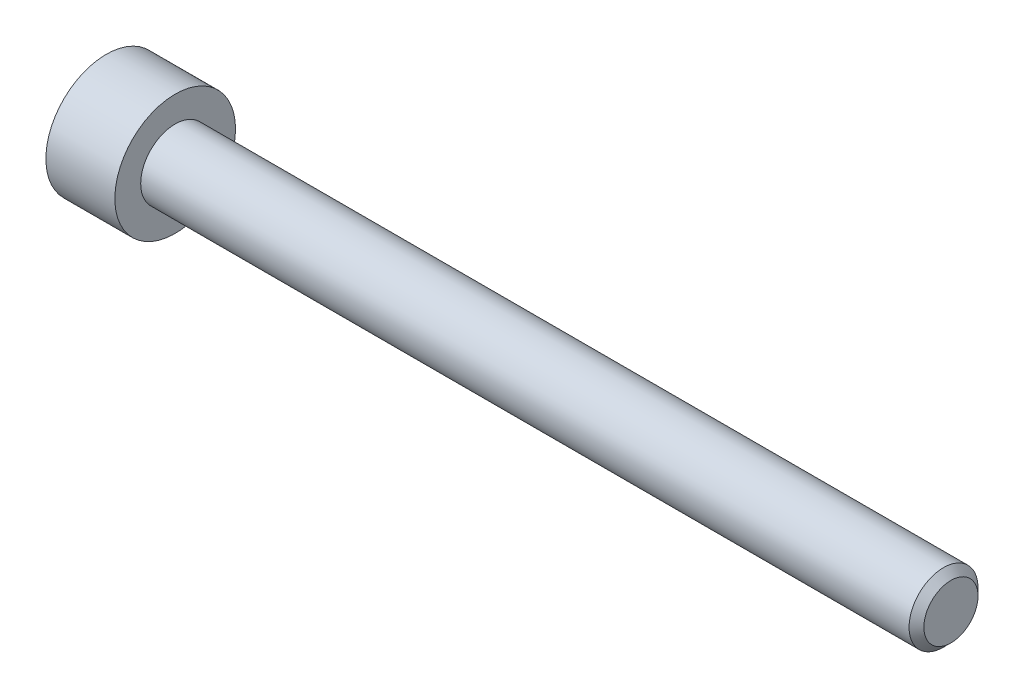
ISO-10303-21;
HEADER;
FILE_DESCRIPTION(('STEP AP214'),'2;1');
FILE_NAME('part.step','',(''),(''),'','','');
FILE_SCHEMA(('AUTOMOTIVE_DESIGN { 1 0 10303 214 1 1 1 1 }'));
ENDSEC;
DATA;
#1=APPLICATION_CONTEXT('core data for automotive mechanical design processes');
#2=APPLICATION_PROTOCOL_DEFINITION('international standard','automotive_design',2000,#1);
#3=PRODUCT_CONTEXT('',#1,'mechanical');
#4=PRODUCT('Part','Part','',(#3));
#5=PRODUCT_RELATED_PRODUCT_CATEGORY('part','',(#4));
#6=PRODUCT_DEFINITION_FORMATION('','',#4);
#7=PRODUCT_DEFINITION_CONTEXT('part definition',#1,'design');
#8=PRODUCT_DEFINITION('design','',#6,#7);
#9=PRODUCT_DEFINITION_SHAPE('','',#8);
#10=(LENGTH_UNIT() NAMED_UNIT(*) SI_UNIT(.MILLI.,.METRE.));
#11=(NAMED_UNIT(*) PLANE_ANGLE_UNIT() SI_UNIT($,.RADIAN.));
#12=(NAMED_UNIT(*) SI_UNIT($,.STERADIAN.) SOLID_ANGLE_UNIT());
#13=UNCERTAINTY_MEASURE_WITH_UNIT(LENGTH_MEASURE(1.E-05),#10,'distance_accuracy_value','');
#14=(GEOMETRIC_REPRESENTATION_CONTEXT(3) GLOBAL_UNCERTAINTY_ASSIGNED_CONTEXT((#13)) GLOBAL_UNIT_ASSIGNED_CONTEXT((#10,
#11,#12)) REPRESENTATION_CONTEXT('',''));
#15=CARTESIAN_POINT('',(0.,0.,0.));
#16=DIRECTION('',(0.,0.,1.));
#17=DIRECTION('',(1.,0.,0.));
#18=AXIS2_PLACEMENT_3D('',#15,#16,#17);
#19=CARTESIAN_POINT('',(-2.,0.,0.));
#20=DIRECTION('',(-1.,0.,0.));
#21=DIRECTION('',(0.,0.,1.));
#22=AXIS2_PLACEMENT_3D('',#19,#20,#21);
#23=PLANE('',#22);
#24=DIRECTION('',(0.,-1.,0.));
#25=VECTOR('',#24,1.);
#26=CARTESIAN_POINT('',(-2.,0.86602540378444,-1.5));
#27=LINE('',#26,#25);
#28=CARTESIAN_POINT('',(-2.,0.86602540378444,-1.5));
#29=VERTEX_POINT('',#28);
#30=CARTESIAN_POINT('',(-1.99999999998317,0.,-1.5));
#31=VERTEX_POINT('',#30);
#32=EDGE_CURVE('E157',#29,#31,#27,.T.);
#33=ORIENTED_EDGE('',*,*,#32,.T.);
#34=CARTESIAN_POINT('',(-1.99999999998317,0.,0.));
#35=DIRECTION('',(1.,0.,0.));
#36=DIRECTION('',(0.,0.,-1.));
#37=AXIS2_PLACEMENT_3D('',#34,#35,#36);
#38=CIRCLE('',#37,1.50000000002137);
#39=CARTESIAN_POINT('',(-1.99999999998317,1.29903810569517,-0.750000000010688));
#40=VERTEX_POINT('',#39);
#41=EDGE_CURVE('E48',#31,#40,#38,.T.);
#42=ORIENTED_EDGE('',*,*,#41,.T.);
#43=DIRECTION('',(0.,-0.500000000000001,-0.866025403784438));
#44=VECTOR('',#43,1.);
#45=CARTESIAN_POINT('',(-2.,1.73205080756888,0.));
#46=LINE('',#45,#44);
#47=EDGE_CURVE('E227',#40,#29,#46,.T.);
#48=ORIENTED_EDGE('',*,*,#47,.T.);
#49=EDGE_LOOP('',(#33,#42,#48));
#50=FACE_BOUND('',#49,.T.);
#51=ADVANCED_FACE('F33',(#50),#23,.T.);
#52=CARTESIAN_POINT('',(-2.,1.73205080756888,0.));
#53=VERTEX_POINT('',#52);
#54=EDGE_CURVE('E228',#53,#40,#46,.T.);
#55=ORIENTED_EDGE('',*,*,#54,.T.);
#56=CARTESIAN_POINT('',(-1.99999999998317,1.29903810569517,0.750000000010688));
#57=VERTEX_POINT('',#56);
#58=EDGE_CURVE('E196',#40,#57,#38,.T.);
#59=ORIENTED_EDGE('',*,*,#58,.T.);
#60=DIRECTION('',(0.,0.500000000000001,-0.866025403784438));
#61=VECTOR('',#60,1.);
#62=CARTESIAN_POINT('',(-2.,0.866025403784439,1.5));
#63=LINE('',#62,#61);
#64=EDGE_CURVE('E224',#57,#53,#63,.T.);
#65=ORIENTED_EDGE('',*,*,#64,.T.);
#66=EDGE_LOOP('',(#55,#59,#65));
#67=FACE_BOUND('',#66,.T.);
#68=ADVANCED_FACE('F120',(#67),#23,.T.);
#69=CARTESIAN_POINT('',(-2.,0.866025403784439,1.5));
#70=VERTEX_POINT('',#69);
#71=EDGE_CURVE('E225',#70,#57,#63,.T.);
#72=ORIENTED_EDGE('',*,*,#71,.T.);
#73=CARTESIAN_POINT('',(-1.99999999998317,0.,1.50000000002137));
#74=VERTEX_POINT('',#73);
#75=EDGE_CURVE('E200',#57,#74,#38,.T.);
#76=ORIENTED_EDGE('',*,*,#75,.T.);
#77=DIRECTION('',(0.,1.,0.));
#78=VECTOR('',#77,1.);
#79=CARTESIAN_POINT('',(-2.,-0.866025403784439,1.5));
#80=LINE('',#79,#78);
#81=EDGE_CURVE('E221',#74,#70,#80,.T.);
#82=ORIENTED_EDGE('',*,*,#81,.T.);
#83=EDGE_LOOP('',(#72,#76,#82));
#84=FACE_BOUND('',#83,.T.);
#85=ADVANCED_FACE('F126',(#84),#23,.T.);
#86=CARTESIAN_POINT('',(-2.,-0.866025403784439,1.5));
#87=VERTEX_POINT('',#86);
#88=EDGE_CURVE('E216',#87,#74,#80,.T.);
#89=ORIENTED_EDGE('',*,*,#88,.T.);
#90=CARTESIAN_POINT('',(-1.99999999998317,-1.29903810569517,0.750000000010688));
#91=VERTEX_POINT('',#90);
#92=EDGE_CURVE('E205',#74,#91,#38,.T.);
#93=ORIENTED_EDGE('',*,*,#92,.T.);
#94=DIRECTION('',(0.,0.500000000000001,0.866025403784438));
#95=VECTOR('',#94,1.);
#96=CARTESIAN_POINT('',(-2.,-1.73205080756888,0.));
#97=LINE('',#96,#95);
#98=EDGE_CURVE('E177',#91,#87,#97,.T.);
#99=ORIENTED_EDGE('',*,*,#98,.T.);
#100=EDGE_LOOP('',(#89,#93,#99));
#101=FACE_BOUND('',#100,.T.);
#102=ADVANCED_FACE('F141',(#101),#23,.T.);
#103=CARTESIAN_POINT('',(-2.,-1.73205080756888,0.));
#104=VERTEX_POINT('',#103);
#105=EDGE_CURVE('E219',#104,#91,#97,.T.);
#106=ORIENTED_EDGE('',*,*,#105,.T.);
#107=CARTESIAN_POINT('',(-1.99999999998317,-1.29903810569517,-0.750000000010686));
#108=VERTEX_POINT('',#107);
#109=EDGE_CURVE('E208',#91,#108,#38,.T.);
#110=ORIENTED_EDGE('',*,*,#109,.T.);
#111=DIRECTION('',(0.,-0.5,0.866025403784439));
#112=VECTOR('',#111,1.);
#113=CARTESIAN_POINT('',(-2.,-0.866025403784439,-1.5));
#114=LINE('',#113,#112);
#115=EDGE_CURVE('E153',#108,#104,#114,.T.);
#116=ORIENTED_EDGE('',*,*,#115,.T.);
#117=EDGE_LOOP('',(#106,#110,#116));
#118=FACE_BOUND('',#117,.T.);
#119=ADVANCED_FACE('F132',(#118),#23,.T.);
#120=CARTESIAN_POINT('',(-2.,-0.866025403784439,-1.5));
#121=VERTEX_POINT('',#120);
#122=EDGE_CURVE('E145',#121,#108,#114,.T.);
#123=ORIENTED_EDGE('',*,*,#122,.T.);
#124=EDGE_CURVE('E146',#108,#31,#38,.T.);
#125=ORIENTED_EDGE('',*,*,#124,.T.);
#126=EDGE_CURVE('E148',#31,#121,#27,.T.);
#127=ORIENTED_EDGE('',*,*,#126,.T.);
#128=EDGE_LOOP('',(#123,#125,#127));
#129=FACE_BOUND('',#128,.T.);
#130=ADVANCED_FACE('F122',(#129),#23,.T.);
#131=CARTESIAN_POINT('',(0.,0.,0.));
#132=DIRECTION('',(1.,0.,0.));
#133=DIRECTION('',(0.,0.,-1.));
#134=AXIS2_PLACEMENT_3D('',#131,#132,#133);
#135=PLANE('',#134);
#136=CARTESIAN_POINT('',(0.,0.,0.));
#137=DIRECTION('',(1.,0.,0.));
#138=DIRECTION('',(0.,0.,-1.));
#139=AXIS2_PLACEMENT_3D('',#136,#137,#138);
#140=CIRCLE('',#139,3.5);
#141=CARTESIAN_POINT('',(0.,0.,-3.5));
#142=VERTEX_POINT('',#141);
#143=EDGE_CURVE('E190',#142,#142,#140,.T.);
#144=ORIENTED_EDGE('',*,*,#143,.T.);
#145=EDGE_LOOP('',(#144));
#146=FACE_BOUND('',#145,.T.);
#147=CARTESIAN_POINT('',(0.,0.,0.));
#148=DIRECTION('',(1.,0.,0.));
#149=DIRECTION('',(0.,0.,-1.));
#150=AXIS2_PLACEMENT_3D('',#147,#148,#149);
#151=CIRCLE('',#150,2.);
#152=CARTESIAN_POINT('',(0.,0.,2.));
#153=VERTEX_POINT('',#152);
#154=EDGE_CURVE('E180',#153,#153,#151,.T.);
#155=ORIENTED_EDGE('',*,*,#154,.F.);
#156=EDGE_LOOP('',(#155));
#157=FACE_BOUND('',#156,.T.);
#158=ADVANCED_FACE('F131',(#146,#157),#135,.T.);
#159=CARTESIAN_POINT('',(-4.,0.,0.));
#160=DIRECTION('',(1.,0.,0.));
#161=DIRECTION('',(0.,0.,-1.));
#162=AXIS2_PLACEMENT_3D('',#159,#160,#161);
#163=CYLINDRICAL_SURFACE('',#162,3.5);
#164=CARTESIAN_POINT('',(-4.,0.,0.));
#165=DIRECTION('',(1.,0.,0.));
#166=DIRECTION('',(0.,0.,-1.));
#167=AXIS2_PLACEMENT_3D('',#164,#165,#166);
#168=CIRCLE('',#167,3.5);
#169=CARTESIAN_POINT('',(-4.,0.,-3.5));
#170=VERTEX_POINT('',#169);
#171=EDGE_CURVE('E193',#170,#170,#168,.T.);
#172=ORIENTED_EDGE('',*,*,#171,.T.);
#173=EDGE_LOOP('',(#172));
#174=FACE_BOUND('',#173,.T.);
#175=ORIENTED_EDGE('',*,*,#143,.F.);
#176=EDGE_LOOP('',(#175));
#177=FACE_BOUND('',#176,.T.);
#178=ADVANCED_FACE('F138',(#174,#177),#163,.T.);
#179=CARTESIAN_POINT('',(-4.,3.5,0.));
#180=DIRECTION('',(-1.,0.,0.));
#181=DIRECTION('',(0.,0.,1.));
#182=AXIS2_PLACEMENT_3D('',#179,#180,#181);
#183=PLANE('',#182);
#184=DIRECTION('',(0.,0.500000000000001,0.866025403784438));
#185=VECTOR('',#184,1.);
#186=CARTESIAN_POINT('',(-4.,-1.73205080756888,0.));
#187=LINE('',#186,#185);
#188=CARTESIAN_POINT('',(-4.,-1.73205080756888,0.));
#189=VERTEX_POINT('',#188);
#190=CARTESIAN_POINT('',(-4.,-0.866025403784439,1.5));
#191=VERTEX_POINT('',#190);
#192=EDGE_CURVE('E56',#189,#191,#187,.T.);
#193=ORIENTED_EDGE('',*,*,#192,.F.);
#194=DIRECTION('',(0.,-0.5,0.866025403784439));
#195=VECTOR('',#194,1.);
#196=CARTESIAN_POINT('',(-4.,-0.866025403784439,-1.5));
#197=LINE('',#196,#195);
#198=CARTESIAN_POINT('',(-4.,-0.866025403784439,-1.5));
#199=VERTEX_POINT('',#198);
#200=EDGE_CURVE('E174',#199,#189,#197,.T.);
#201=ORIENTED_EDGE('',*,*,#200,.F.);
#202=DIRECTION('',(0.,-1.,0.));
#203=VECTOR('',#202,1.);
#204=CARTESIAN_POINT('',(-4.,0.86602540378444,-1.5));
#205=LINE('',#204,#203);
#206=CARTESIAN_POINT('',(-4.,0.86602540378444,-1.5));
#207=VERTEX_POINT('',#206);
#208=EDGE_CURVE('E171',#207,#199,#205,.T.);
#209=ORIENTED_EDGE('',*,*,#208,.F.);
#210=DIRECTION('',(0.,-0.500000000000001,-0.866025403784438));
#211=VECTOR('',#210,1.);
#212=CARTESIAN_POINT('',(-4.,1.73205080756888,0.));
#213=LINE('',#212,#211);
#214=CARTESIAN_POINT('',(-4.,1.73205080756888,0.));
#215=VERTEX_POINT('',#214);
#216=EDGE_CURVE('E168',#215,#207,#213,.T.);
#217=ORIENTED_EDGE('',*,*,#216,.F.);
#218=DIRECTION('',(0.,0.500000000000001,-0.866025403784438));
#219=VECTOR('',#218,1.);
#220=CARTESIAN_POINT('',(-4.,0.866025403784439,1.5));
#221=LINE('',#220,#219);
#222=CARTESIAN_POINT('',(-4.,0.866025403784439,1.5));
#223=VERTEX_POINT('',#222);
#224=EDGE_CURVE('E165',#223,#215,#221,.T.);
#225=ORIENTED_EDGE('',*,*,#224,.F.);
#226=DIRECTION('',(0.,1.,0.));
#227=VECTOR('',#226,1.);
#228=CARTESIAN_POINT('',(-4.,-0.866025403784439,1.5));
#229=LINE('',#228,#227);
#230=EDGE_CURVE('E162',#191,#223,#229,.T.);
#231=ORIENTED_EDGE('',*,*,#230,.F.);
#232=EDGE_LOOP('',(#193,#201,#209,#217,#225,#231));
#233=FACE_BOUND('',#232,.T.);
#234=ORIENTED_EDGE('',*,*,#171,.F.);
#235=EDGE_LOOP('',(#234));
#236=FACE_BOUND('',#235,.T.);
#237=ADVANCED_FACE('F242',(#233,#236),#183,.T.);
#238=CARTESIAN_POINT('',(45.,0.,0.));
#239=DIRECTION('',(-1.,0.,0.));
#240=DIRECTION('',(0.,0.,1.));
#241=AXIS2_PLACEMENT_3D('',#238,#239,#240);
#242=CYLINDRICAL_SURFACE('',#241,2.);
#243=CARTESIAN_POINT('',(44.570499999999,0.,0.));
#244=DIRECTION('',(1.,0.,0.));
#245=DIRECTION('',(0.,0.,-1.));
#246=AXIS2_PLACEMENT_3D('',#243,#244,#245);
#247=CIRCLE('',#246,2.);
#248=CARTESIAN_POINT('',(44.570499999999,0.,2.));
#249=VERTEX_POINT('',#248);
#250=EDGE_CURVE('E11',#249,#249,#247,.F.);
#251=CARTESIAN_POINT('',(44.570499999999,0.,2.));
#252=CARTESIAN_POINT('',(44.1062239583324,0.,2.));
#253=CARTESIAN_POINT('',(43.6419479166657,0.,2.));
#254=CARTESIAN_POINT('',(42.7133958333324,0.,2.));
#255=CARTESIAN_POINT('',(42.2491197916657,0.,2.));
#256=CARTESIAN_POINT('',(41.3205677083324,0.,2.));
#257=CARTESIAN_POINT('',(40.8562916666658,0.,2.));
#258=CARTESIAN_POINT('',(39.9277395833325,0.,2.));
#259=CARTESIAN_POINT('',(39.4634635416658,0.,2.));
#260=CARTESIAN_POINT('',(38.5349114583325,0.,2.));
#261=CARTESIAN_POINT('',(38.0706354166658,0.,2.));
#262=CARTESIAN_POINT('',(37.1420833333325,0.,2.));
#263=CARTESIAN_POINT('',(36.6778072916659,0.,2.));
#264=CARTESIAN_POINT('',(35.7492552083326,0.,2.));
#265=CARTESIAN_POINT('',(35.2849791666659,0.,2.));
#266=CARTESIAN_POINT('',(34.3564270833326,0.,2.));
#267=CARTESIAN_POINT('',(33.8921510416659,0.,2.));
#268=CARTESIAN_POINT('',(32.9635989583326,0.,2.));
#269=CARTESIAN_POINT('',(32.499322916666,0.,2.));
#270=CARTESIAN_POINT('',(31.5707708333326,0.,2.));
#271=CARTESIAN_POINT('',(31.106494791666,0.,2.));
#272=CARTESIAN_POINT('',(30.1779427083327,0.,2.));
#273=CARTESIAN_POINT('',(29.713666666666,0.,2.));
#274=CARTESIAN_POINT('',(28.7851145833327,0.,2.));
#275=CARTESIAN_POINT('',(28.320838541666,0.,2.));
#276=CARTESIAN_POINT('',(27.3922864583327,0.,2.));
#277=CARTESIAN_POINT('',(26.9280104166661,0.,2.));
#278=CARTESIAN_POINT('',(25.9994583333328,0.,2.));
#279=CARTESIAN_POINT('',(25.5351822916661,0.,2.));
#280=CARTESIAN_POINT('',(24.6066302083328,0.,2.));
#281=CARTESIAN_POINT('',(24.1423541666661,0.,2.));
#282=CARTESIAN_POINT('',(23.2138020833328,0.,2.));
#283=CARTESIAN_POINT('',(22.7495260416662,0.,2.));
#284=CARTESIAN_POINT('',(21.8209739583329,0.,2.));
#285=CARTESIAN_POINT('',(21.3566979166662,0.,2.));
#286=CARTESIAN_POINT('',(20.4281458333329,0.,2.));
#287=CARTESIAN_POINT('',(19.9638697916662,0.,2.));
#288=CARTESIAN_POINT('',(19.0353177083329,0.,2.));
#289=CARTESIAN_POINT('',(18.5710416666663,0.,2.));
#290=CARTESIAN_POINT('',(17.6424895833329,0.,2.));
#291=CARTESIAN_POINT('',(17.1782135416663,0.,2.));
#292=CARTESIAN_POINT('',(16.249661458333,0.,2.));
#293=CARTESIAN_POINT('',(15.7853854166663,0.,2.));
#294=CARTESIAN_POINT('',(14.856833333333,0.,2.));
#295=CARTESIAN_POINT('',(14.3925572916663,0.,2.));
#296=CARTESIAN_POINT('',(13.464005208333,0.,2.));
#297=CARTESIAN_POINT('',(12.9997291666664,0.,2.));
#298=CARTESIAN_POINT('',(12.0711770833331,0.,2.));
#299=CARTESIAN_POINT('',(11.6069010416664,0.,2.));
#300=CARTESIAN_POINT('',(10.6783489583331,0.,2.));
#301=CARTESIAN_POINT('',(10.2140729166664,0.,2.));
#302=CARTESIAN_POINT('',(9.28552083333312,0.,2.));
#303=CARTESIAN_POINT('',(8.82124479166647,0.,2.));
#304=CARTESIAN_POINT('',(7.89269270833316,0.,2.));
#305=CARTESIAN_POINT('',(7.4284166666665,0.,2.));
#306=CARTESIAN_POINT('',(6.49986458333319,0.,2.));
#307=CARTESIAN_POINT('',(6.03558854166653,0.,2.));
#308=CARTESIAN_POINT('',(5.10703645833321,0.,2.));
#309=CARTESIAN_POINT('',(4.64276041666656,0.,2.));
#310=CARTESIAN_POINT('',(3.71420833333325,0.,2.));
#311=CARTESIAN_POINT('',(3.24993229166659,0.,2.));
#312=CARTESIAN_POINT('',(2.32138020833328,0.,2.));
#313=CARTESIAN_POINT('',(1.85710416666662,0.,2.));
#314=CARTESIAN_POINT('',(0.928552083333305,0.,2.));
#315=CARTESIAN_POINT('',(0.464276041666648,0.,2.));
#316=CARTESIAN_POINT('',(0.,0.,2.));
#317=B_SPLINE_CURVE_WITH_KNOTS('',3,(#251,#252,#253,#254,#255,#256,#257,#258,#259,#260,#261,
#262,#263,#264,#265,#266,#267,#268,#269,#270,#271,#272,#273,#274,#275,#276,#277,#278,#279,#280,
#281,#282,#283,#284,#285,#286,#287,#288,#289,#290,#291,#292,#293,#294,#295,#296,#297,#298,#299,
#300,#301,#302,#303,#304,#305,#306,#307,#308,#309,#310,#311,#312,#313,#314,#315,#316),
.UNSPECIFIED.,.F.,.F.,(4,2,2,2,2,2,2,2,2,2,2,2,2,2,2,2,2,2,2,2,2,2,2,2,2,2,2,2,2,2,2,2,4),(0.,
1.39282812499997,2.78565624999993,4.1784843749999,5.57131249999988,6.96414062499984,
8.35696874999981,9.74979687499979,11.1426249999998,12.5354531249997,13.9282812499997,
15.3211093749997,16.7139374999996,18.1067656249996,19.4995937499996,20.8924218749995,
22.2852499999995,23.6780781249995,25.0709062499994,26.4637343749994,27.8565624999994,
29.2493906249994,30.6422187499993,32.0350468749993,33.4278749999993,34.8207031249992,
36.2135312499992,37.6063593749992,38.9991874999992,40.3920156249991,41.7848437499991,
43.1776718749991,44.570499999999),.UNSPECIFIED.);
#318=EDGE_CURVE('BSEAM264',#249,#153,#317,.T.);
#319=ORIENTED_EDGE('',*,*,#250,.T.);
#320=ORIENTED_EDGE('',*,*,#154,.T.);
#321=ORIENTED_EDGE('',*,*,#318,.T.);
#322=ORIENTED_EDGE('',*,*,#318,.F.);
#323=EDGE_LOOP('',(#319,#321,#320,#322));
#324=FACE_BOUND('',#323,.T.);
#325=ADVANCED_FACE('F264',(#324),#242,.T.);
#326=CARTESIAN_POINT('',(45.,0.,0.));
#327=DIRECTION('',(1.,0.,0.));
#328=DIRECTION('',(0.,0.,-1.));
#329=AXIS2_PLACEMENT_3D('',#326,#327,#328);
#330=PLANE('',#329);
#331=CARTESIAN_POINT('',(45.,0.,0.));
#332=DIRECTION('',(1.,0.,0.));
#333=DIRECTION('',(0.,0.,-1.));
#334=AXIS2_PLACEMENT_3D('',#331,#332,#333);
#335=CIRCLE('',#334,1.57049999999902);
#336=CARTESIAN_POINT('',(45.,0.,-1.57049999999902));
#337=VERTEX_POINT('',#336);
#338=EDGE_CURVE('E41',#337,#337,#335,.T.);
#339=ORIENTED_EDGE('',*,*,#338,.T.);
#340=EDGE_LOOP('',(#339));
#341=FACE_BOUND('',#340,.T.);
#342=ADVANCED_FACE('F261',(#341),#330,.T.);
#343=CARTESIAN_POINT('',(-2.,-1.73205080756888,0.));
#344=DIRECTION('',(0.,-0.866025403784438,0.500000000000001));
#345=DIRECTION('',(0.,-0.500000000000001,-0.866025403784438));
#346=AXIS2_PLACEMENT_3D('',#343,#344,#345);
#347=PLANE('',#346);
#348=ORIENTED_EDGE('',*,*,#192,.T.);
#349=DIRECTION('',(-1.,0.,0.));
#350=VECTOR('',#349,1.);
#351=CARTESIAN_POINT('',(-2.,-0.866025403784439,1.5));
#352=LINE('',#351,#350);
#353=EDGE_CURVE('E152',#87,#191,#352,.T.);
#354=ORIENTED_EDGE('',*,*,#353,.F.);
#355=ORIENTED_EDGE('',*,*,#98,.F.);
#356=ORIENTED_EDGE('',*,*,#105,.F.);
#357=DIRECTION('',(-1.,0.,0.));
#358=VECTOR('',#357,1.);
#359=CARTESIAN_POINT('',(-2.,-1.73205080756888,0.));
#360=LINE('',#359,#358);
#361=EDGE_CURVE('E178',#104,#189,#360,.T.);
#362=ORIENTED_EDGE('',*,*,#361,.T.);
#363=EDGE_LOOP('',(#348,#354,#355,#356,#362));
#364=FACE_BOUND('',#363,.T.);
#365=ADVANCED_FACE('F218',(#364),#347,.F.);
#366=CARTESIAN_POINT('',(-2.,-0.866025403784439,-1.5));
#367=DIRECTION('',(0.,-0.866025403784439,-0.5));
#368=DIRECTION('',(0.,0.5,-0.866025403784439));
#369=AXIS2_PLACEMENT_3D('',#366,#367,#368);
#370=PLANE('',#369);
#371=ORIENTED_EDGE('',*,*,#200,.T.);
#372=ORIENTED_EDGE('',*,*,#361,.F.);
#373=ORIENTED_EDGE('',*,*,#115,.F.);
#374=ORIENTED_EDGE('',*,*,#122,.F.);
#375=DIRECTION('',(-1.,0.,0.));
#376=VECTOR('',#375,1.);
#377=CARTESIAN_POINT('',(-2.,-0.866025403784439,-1.5));
#378=LINE('',#377,#376);
#379=EDGE_CURVE('E181',#121,#199,#378,.T.);
#380=ORIENTED_EDGE('',*,*,#379,.T.);
#381=EDGE_LOOP('',(#371,#372,#373,#374,#380));
#382=FACE_BOUND('',#381,.T.);
#383=ADVANCED_FACE('F239',(#382),#370,.F.);
#384=CARTESIAN_POINT('',(-2.,0.86602540378444,-1.5));
#385=DIRECTION('',(0.,0.,-1.));
#386=DIRECTION('',(0.,1.,0.));
#387=AXIS2_PLACEMENT_3D('',#384,#385,#386);
#388=PLANE('',#387);
#389=ORIENTED_EDGE('',*,*,#208,.T.);
#390=ORIENTED_EDGE('',*,*,#379,.F.);
#391=ORIENTED_EDGE('',*,*,#126,.F.);
#392=ORIENTED_EDGE('',*,*,#32,.F.);
#393=DIRECTION('',(-1.,0.,0.));
#394=VECTOR('',#393,1.);
#395=CARTESIAN_POINT('',(-2.,0.86602540378444,-1.5));
#396=LINE('',#395,#394);
#397=EDGE_CURVE('E183',#29,#207,#396,.T.);
#398=ORIENTED_EDGE('',*,*,#397,.T.);
#399=EDGE_LOOP('',(#389,#390,#391,#392,#398));
#400=FACE_BOUND('',#399,.T.);
#401=ADVANCED_FACE('F237',(#400),#388,.F.);
#402=CARTESIAN_POINT('',(-2.,1.73205080756888,0.));
#403=DIRECTION('',(0.,0.866025403784438,-0.500000000000001));
#404=DIRECTION('',(0.,0.500000000000001,0.866025403784438));
#405=AXIS2_PLACEMENT_3D('',#402,#403,#404);
#406=PLANE('',#405);
#407=ORIENTED_EDGE('',*,*,#216,.T.);
#408=ORIENTED_EDGE('',*,*,#397,.F.);
#409=ORIENTED_EDGE('',*,*,#47,.F.);
#410=ORIENTED_EDGE('',*,*,#54,.F.);
#411=DIRECTION('',(-1.,0.,0.));
#412=VECTOR('',#411,1.);
#413=CARTESIAN_POINT('',(-2.,1.73205080756888,0.));
#414=LINE('',#413,#412);
#415=EDGE_CURVE('E185',#53,#215,#414,.T.);
#416=ORIENTED_EDGE('',*,*,#415,.T.);
#417=EDGE_LOOP('',(#407,#408,#409,#410,#416));
#418=FACE_BOUND('',#417,.T.);
#419=ADVANCED_FACE('F233',(#418),#406,.F.);
#420=CARTESIAN_POINT('',(-2.,0.866025403784439,1.5));
#421=DIRECTION('',(0.,0.866025403784438,0.500000000000001));
#422=DIRECTION('',(0.,-0.500000000000001,0.866025403784438));
#423=AXIS2_PLACEMENT_3D('',#420,#421,#422);
#424=PLANE('',#423);
#425=ORIENTED_EDGE('',*,*,#224,.T.);
#426=ORIENTED_EDGE('',*,*,#415,.F.);
#427=ORIENTED_EDGE('',*,*,#64,.F.);
#428=ORIENTED_EDGE('',*,*,#71,.F.);
#429=DIRECTION('',(-1.,0.,0.));
#430=VECTOR('',#429,1.);
#431=CARTESIAN_POINT('',(-2.,0.866025403784439,1.5));
#432=LINE('',#431,#430);
#433=EDGE_CURVE('E155',#70,#223,#432,.T.);
#434=ORIENTED_EDGE('',*,*,#433,.T.);
#435=EDGE_LOOP('',(#425,#426,#427,#428,#434));
#436=FACE_BOUND('',#435,.T.);
#437=ADVANCED_FACE('F115',(#436),#424,.F.);
#438=CARTESIAN_POINT('',(-2.,-0.866025403784439,1.5));
#439=DIRECTION('',(0.,0.,1.));
#440=DIRECTION('',(1.,0.,0.));
#441=AXIS2_PLACEMENT_3D('',#438,#439,#440);
#442=PLANE('',#441);
#443=ORIENTED_EDGE('',*,*,#230,.T.);
#444=ORIENTED_EDGE('',*,*,#433,.F.);
#445=ORIENTED_EDGE('',*,*,#81,.F.);
#446=ORIENTED_EDGE('',*,*,#88,.F.);
#447=ORIENTED_EDGE('',*,*,#353,.T.);
#448=EDGE_LOOP('',(#443,#444,#445,#446,#447));
#449=FACE_BOUND('',#448,.T.);
#450=ADVANCED_FACE('F108',(#449),#442,.F.);
#451=CARTESIAN_POINT('',(-1.59807621121946,0.,0.));
#452=DIRECTION('',(-1.,0.,0.));
#453=DIRECTION('',(0.,0.,1.));
#454=AXIS2_PLACEMENT_3D('',#451,#452,#453);
#455=CONICAL_SURFACE('',#454,0.,1.30899693892652);
#456=ORIENTED_EDGE('',*,*,#41,.F.);
#457=ORIENTED_EDGE('',*,*,#124,.F.);
#458=ORIENTED_EDGE('',*,*,#109,.F.);
#459=ORIENTED_EDGE('',*,*,#92,.F.);
#460=ORIENTED_EDGE('',*,*,#75,.F.);
#461=ORIENTED_EDGE('',*,*,#58,.F.);
#462=EDGE_LOOP('',(#456,#457,#458,#459,#460,#461));
#463=FACE_BOUND('',#462,.T.);
#464=CARTESIAN_POINT('',(-1.59807621121946,0.,0.));
#465=VERTEX_POINT('',#464);
#466=VERTEX_LOOP('',#465);
#467=FACE_BOUND('',#466,.T.);
#468=ADVANCED_FACE('F106',(#463,#467),#455,.F.);
#469=CARTESIAN_POINT('',(45.,0.,0.));
#470=DIRECTION('',(-1.,0.,0.));
#471=DIRECTION('',(0.,0.,1.));
#472=AXIS2_PLACEMENT_3D('',#469,#470,#471);
#473=CONICAL_SURFACE('',#472,1.57049999999902,0.785398163397455);
#474=ORIENTED_EDGE('',*,*,#250,.F.);
#475=EDGE_LOOP('',(#474));
#476=FACE_BOUND('',#475,.T.);
#477=ORIENTED_EDGE('',*,*,#338,.F.);
#478=EDGE_LOOP('',(#477));
#479=FACE_BOUND('',#478,.T.);
#480=ADVANCED_FACE('F35',(#476,#479),#473,.T.);
#481=CLOSED_SHELL('',(#51,#68,#85,#102,#119,#130,#158,#178,#237,#325,#342,#365,#383,#401,#419,
#437,#450,#468,#480));
#482=MANIFOLD_SOLID_BREP('B2',#481);
#483=ADVANCED_BREP_SHAPE_REPRESENTATION('',(#18,#482),#14);
#484=SHAPE_DEFINITION_REPRESENTATION(#9,#483);
ENDSEC;
END-ISO-10303-21;
